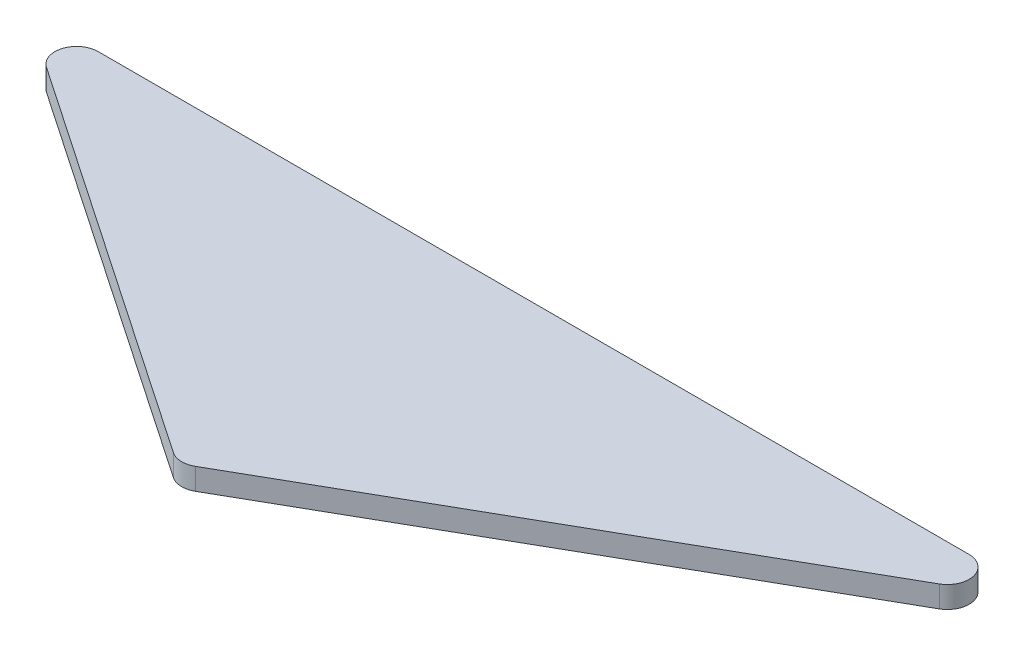
ISO-10303-21;
HEADER;
FILE_DESCRIPTION(('STEP AP214'),'2;1');
FILE_NAME('part.step','',(''),(''),'','','');
FILE_SCHEMA(('AUTOMOTIVE_DESIGN { 1 0 10303 214 1 1 1 1 }'));
ENDSEC;
DATA;
#1=APPLICATION_CONTEXT('core data for automotive mechanical design processes');
#2=APPLICATION_PROTOCOL_DEFINITION('international standard','automotive_design',2000,#1);
#3=PRODUCT_CONTEXT('',#1,'mechanical');
#4=PRODUCT('Part','Part','',(#3));
#5=PRODUCT_RELATED_PRODUCT_CATEGORY('part','',(#4));
#6=PRODUCT_DEFINITION_FORMATION('','',#4);
#7=PRODUCT_DEFINITION_CONTEXT('part definition',#1,'design');
#8=PRODUCT_DEFINITION('design','',#6,#7);
#9=PRODUCT_DEFINITION_SHAPE('','',#8);
#10=(LENGTH_UNIT() NAMED_UNIT(*) SI_UNIT(.MILLI.,.METRE.));
#11=(NAMED_UNIT(*) PLANE_ANGLE_UNIT() SI_UNIT($,.RADIAN.));
#12=(NAMED_UNIT(*) SI_UNIT($,.STERADIAN.) SOLID_ANGLE_UNIT());
#13=UNCERTAINTY_MEASURE_WITH_UNIT(LENGTH_MEASURE(1.E-05),#10,'distance_accuracy_value','');
#14=(GEOMETRIC_REPRESENTATION_CONTEXT(3) GLOBAL_UNCERTAINTY_ASSIGNED_CONTEXT((#13)) GLOBAL_UNIT_ASSIGNED_CONTEXT((#10,
#11,#12)) REPRESENTATION_CONTEXT('',''));
#15=CARTESIAN_POINT('',(0.,0.,0.));
#16=DIRECTION('',(0.,0.,1.));
#17=DIRECTION('',(1.,0.,0.));
#18=AXIS2_PLACEMENT_3D('',#15,#16,#17);
#19=CARTESIAN_POINT('',(0.,3.175,0.));
#20=DIRECTION('',(-0.495285329308495,0.,-0.86873036240929));
#21=DIRECTION('',(-0.86873036240929,0.,0.495285329308495));
#22=AXIS2_PLACEMENT_3D('',#19,#20,#21);
#23=PLANE('',#22);
#24=DIRECTION('',(0.86873036240929,0.,-0.495285329308495));
#25=VECTOR('',#24,1.);
#26=CARTESIAN_POINT('',(0.,0.,0.));
#27=LINE('',#26,#25);
#28=CARTESIAN_POINT('',(1.7208405564904,0.,-0.981095076894767));
#29=VERTEX_POINT('',#28);
#30=CARTESIAN_POINT('',(71.2065111279232,0.,-40.5966475202886));
#31=VERTEX_POINT('',#30);
#32=EDGE_CURVE('E125',#29,#31,#27,.T.);
#33=ORIENTED_EDGE('',*,*,#32,.T.);
#34=DIRECTION('',(0.,-1.,0.));
#35=VECTOR('',#34,1.);
#36=CARTESIAN_POINT('',(71.2065111279232,3.175,-40.5966475202886));
#37=LINE('',#36,#35);
#38=CARTESIAN_POINT('',(71.2065111279232,3.175,-40.5966475202886));
#39=VERTEX_POINT('',#38);
#40=EDGE_CURVE('E11',#31,#39,#37,.F.);
#41=ORIENTED_EDGE('',*,*,#40,.T.);
#42=DIRECTION('',(0.86873036240929,0.,-0.495285329308495));
#43=VECTOR('',#42,1.);
#44=CARTESIAN_POINT('',(0.,3.175,0.));
#45=LINE('',#44,#43);
#46=CARTESIAN_POINT('',(1.7208405564904,3.175,-0.981095076894767));
#47=VERTEX_POINT('',#46);
#48=EDGE_CURVE('E116',#47,#39,#45,.T.);
#49=ORIENTED_EDGE('',*,*,#48,.F.);
#50=DIRECTION('',(0.,-1.,0.));
#51=VECTOR('',#50,1.);
#52=CARTESIAN_POINT('',(1.7208405564904,3.175,-0.981095076894767));
#53=LINE('',#52,#51);
#54=EDGE_CURVE('E50',#47,#29,#53,.T.);
#55=ORIENTED_EDGE('',*,*,#54,.T.);
#56=EDGE_LOOP('',(#33,#41,#49,#55));
#57=FACE_BOUND('',#56,.T.);
#58=ADVANCED_FACE('F39',(#57),#23,.F.);
#59=CARTESIAN_POINT('',(81.6133758194562,3.175,-46.529866420938));
#60=DIRECTION('',(0.,0.,1.));
#61=DIRECTION('',(1.,0.,0.));
#62=AXIS2_PLACEMENT_3D('',#59,#60,#61);
#63=PLANE('',#62);
#64=DIRECTION('',(-1.,0.,0.));
#65=VECTOR('',#64,1.);
#66=CARTESIAN_POINT('',(81.6133758194562,0.,-46.529866420938));
#67=LINE('',#66,#65);
#68=CARTESIAN_POINT('',(69.6339802073688,0.,-46.529866420938));
#69=VERTEX_POINT('',#68);
#70=CARTESIAN_POINT('',(-58.0760977187323,0.,-46.529866420938));
#71=VERTEX_POINT('',#70);
#72=EDGE_CURVE('E120',#69,#71,#67,.T.);
#73=ORIENTED_EDGE('',*,*,#72,.T.);
#74=DIRECTION('',(0.,-1.,0.));
#75=VECTOR('',#74,1.);
#76=CARTESIAN_POINT('',(-58.0760977187323,3.175,-46.529866420938));
#77=LINE('',#76,#75);
#78=CARTESIAN_POINT('',(-58.0760977187323,3.175,-46.529866420938));
#79=VERTEX_POINT('',#78);
#80=EDGE_CURVE('E100',#71,#79,#77,.F.);
#81=ORIENTED_EDGE('',*,*,#80,.T.);
#82=DIRECTION('',(-1.,0.,0.));
#83=VECTOR('',#82,1.);
#84=CARTESIAN_POINT('',(81.6133758194562,3.175,-46.529866420938));
#85=LINE('',#84,#83);
#86=CARTESIAN_POINT('',(69.6339802073688,3.175,-46.529866420938));
#87=VERTEX_POINT('',#86);
#88=EDGE_CURVE('E117',#87,#79,#85,.T.);
#89=ORIENTED_EDGE('',*,*,#88,.F.);
#90=DIRECTION('',(0.,-1.,0.));
#91=VECTOR('',#90,1.);
#92=CARTESIAN_POINT('',(69.6339802073688,3.175,-46.529866420938));
#93=LINE('',#92,#91);
#94=EDGE_CURVE('E105',#87,#69,#93,.T.);
#95=ORIENTED_EDGE('',*,*,#94,.T.);
#96=EDGE_LOOP('',(#73,#81,#89,#95));
#97=FACE_BOUND('',#96,.T.);
#98=ADVANCED_FACE('F150',(#97),#63,.F.);
#99=CARTESIAN_POINT('',(0.,3.175,0.));
#100=DIRECTION('',(0.562532896681354,0.,-0.826774902951997));
#101=DIRECTION('',(-0.826774902951998,0.,-0.562532896681354));
#102=AXIS2_PLACEMENT_3D('',#99,#100,#101);
#103=PLANE('',#102);
#104=DIRECTION('',(0.826774902951998,0.,0.562532896681354));
#105=VECTOR('',#104,1.);
#106=CARTESIAN_POINT('',(0.,3.175,0.));
#107=LINE('',#106,#105);
#108=CARTESIAN_POINT('',(-59.8621396656956,3.175,-40.7298561040654));
#109=VERTEX_POINT('',#108);
#110=CARTESIAN_POINT('',(-1.63773231102737,3.175,-1.11430366067167));
#111=VERTEX_POINT('',#110);
#112=EDGE_CURVE('E112',#109,#111,#107,.T.);
#113=ORIENTED_EDGE('',*,*,#112,.F.);
#114=DIRECTION('',(0.,-1.,0.));
#115=VECTOR('',#114,1.);
#116=CARTESIAN_POINT('',(-59.8621396656956,3.175,-40.7298561040654));
#117=LINE('',#116,#115);
#118=CARTESIAN_POINT('',(-59.8621396656956,0.,-40.7298561040654));
#119=VERTEX_POINT('',#118);
#120=EDGE_CURVE('E96',#109,#119,#117,.T.);
#121=ORIENTED_EDGE('',*,*,#120,.T.);
#122=DIRECTION('',(0.826774902951998,0.,0.562532896681354));
#123=VECTOR('',#122,1.);
#124=CARTESIAN_POINT('',(0.,0.,0.));
#125=LINE('',#124,#123);
#126=CARTESIAN_POINT('',(-1.63773231102737,0.,-1.11430366067167));
#127=VERTEX_POINT('',#126);
#128=EDGE_CURVE('E108',#119,#127,#125,.T.);
#129=ORIENTED_EDGE('',*,*,#128,.T.);
#130=DIRECTION('',(0.,-1.,0.));
#131=VECTOR('',#130,1.);
#132=CARTESIAN_POINT('',(-1.63773231102737,3.175,-1.11430366067167));
#133=LINE('',#132,#131);
#134=EDGE_CURVE('E114',#127,#111,#133,.F.);
#135=ORIENTED_EDGE('',*,*,#134,.T.);
#136=EDGE_LOOP('',(#113,#121,#129,#135));
#137=FACE_BOUND('',#136,.T.);
#138=ADVANCED_FACE('F107',(#137),#103,.F.);
#139=CARTESIAN_POINT('',(0.,3.175,0.));
#140=DIRECTION('',(0.,1.,0.));
#141=DIRECTION('',(0.,0.,1.));
#142=AXIS2_PLACEMENT_3D('',#139,#140,#141);
#143=PLANE('',#142);
#144=ORIENTED_EDGE('',*,*,#88,.T.);
#145=CARTESIAN_POINT('',(-58.0760977187323,3.175,-43.354866420938));
#146=DIRECTION('',(0.,1.,0.));
#147=DIRECTION('',(0.,0.,1.));
#148=AXIS2_PLACEMENT_3D('',#145,#146,#147);
#149=CIRCLE('',#148,3.175);
#150=EDGE_CURVE('E132',#79,#109,#149,.T.);
#151=ORIENTED_EDGE('',*,*,#150,.T.);
#152=ORIENTED_EDGE('',*,*,#112,.T.);
#153=CARTESIAN_POINT('',(0.148309635935928,3.175,-3.73931397754426));
#154=DIRECTION('',(0.,1.,0.));
#155=DIRECTION('',(0.,0.,1.));
#156=AXIS2_PLACEMENT_3D('',#153,#154,#155);
#157=CIRCLE('',#156,3.175);
#158=EDGE_CURVE('E56',#111,#47,#157,.T.);
#159=ORIENTED_EDGE('',*,*,#158,.T.);
#160=ORIENTED_EDGE('',*,*,#48,.T.);
#161=CARTESIAN_POINT('',(69.6339802073688,3.175,-43.354866420938));
#162=DIRECTION('',(0.,1.,0.));
#163=DIRECTION('',(0.,0.,1.));
#164=AXIS2_PLACEMENT_3D('',#161,#162,#163);
#165=CIRCLE('',#164,3.175);
#166=EDGE_CURVE('E135',#39,#87,#165,.T.);
#167=ORIENTED_EDGE('',*,*,#166,.T.);
#168=EDGE_LOOP('',(#144,#151,#152,#159,#160,#167));
#169=FACE_BOUND('',#168,.T.);
#170=ADVANCED_FACE('F141',(#169),#143,.T.);
#171=CARTESIAN_POINT('',(0.,0.,0.));
#172=DIRECTION('',(0.,1.,0.));
#173=DIRECTION('',(0.,0.,1.));
#174=AXIS2_PLACEMENT_3D('',#171,#172,#173);
#175=PLANE('',#174);
#176=ORIENTED_EDGE('',*,*,#128,.F.);
#177=CARTESIAN_POINT('',(-58.0760977187323,0.,-43.354866420938));
#178=DIRECTION('',(0.,1.,0.));
#179=DIRECTION('',(0.,0.,1.));
#180=AXIS2_PLACEMENT_3D('',#177,#178,#179);
#181=CIRCLE('',#180,3.175);
#182=EDGE_CURVE('E95',#119,#71,#181,.F.);
#183=ORIENTED_EDGE('',*,*,#182,.T.);
#184=ORIENTED_EDGE('',*,*,#72,.F.);
#185=CARTESIAN_POINT('',(69.6339802073688,0.,-43.354866420938));
#186=DIRECTION('',(0.,1.,0.));
#187=DIRECTION('',(0.,0.,1.));
#188=AXIS2_PLACEMENT_3D('',#185,#186,#187);
#189=CIRCLE('',#188,3.175);
#190=EDGE_CURVE('E103',#69,#31,#189,.F.);
#191=ORIENTED_EDGE('',*,*,#190,.T.);
#192=ORIENTED_EDGE('',*,*,#32,.F.);
#193=CARTESIAN_POINT('',(0.148309635935928,0.,-3.73931397754426));
#194=DIRECTION('',(0.,1.,0.));
#195=DIRECTION('',(0.,0.,1.));
#196=AXIS2_PLACEMENT_3D('',#193,#194,#195);
#197=CIRCLE('',#196,3.175);
#198=EDGE_CURVE('E115',#29,#127,#197,.F.);
#199=ORIENTED_EDGE('',*,*,#198,.T.);
#200=EDGE_LOOP('',(#176,#183,#184,#191,#192,#199));
#201=FACE_BOUND('',#200,.T.);
#202=ADVANCED_FACE('F113',(#201),#175,.F.);
#203=CARTESIAN_POINT('',(-58.0760977187323,3.175,-43.354866420938));
#204=DIRECTION('',(0.,-1.,0.));
#205=DIRECTION('',(0.,0.,-1.));
#206=AXIS2_PLACEMENT_3D('',#203,#204,#205);
#207=CYLINDRICAL_SURFACE('',#206,3.175);
#208=ORIENTED_EDGE('',*,*,#150,.F.);
#209=ORIENTED_EDGE('',*,*,#80,.F.);
#210=ORIENTED_EDGE('',*,*,#182,.F.);
#211=ORIENTED_EDGE('',*,*,#120,.F.);
#212=EDGE_LOOP('',(#208,#209,#210,#211));
#213=FACE_BOUND('',#212,.T.);
#214=ADVANCED_FACE('F92',(#213),#207,.T.);
#215=CARTESIAN_POINT('',(69.6339802073688,3.175,-43.354866420938));
#216=DIRECTION('',(0.,-1.,0.));
#217=DIRECTION('',(0.,0.,-1.));
#218=AXIS2_PLACEMENT_3D('',#215,#216,#217);
#219=CYLINDRICAL_SURFACE('',#218,3.175);
#220=ORIENTED_EDGE('',*,*,#166,.F.);
#221=ORIENTED_EDGE('',*,*,#40,.F.);
#222=ORIENTED_EDGE('',*,*,#190,.F.);
#223=ORIENTED_EDGE('',*,*,#94,.F.);
#224=EDGE_LOOP('',(#220,#221,#222,#223));
#225=FACE_BOUND('',#224,.T.);
#226=ADVANCED_FACE('F149',(#225),#219,.T.);
#227=CARTESIAN_POINT('',(0.148309635935928,3.175,-3.73931397754426));
#228=DIRECTION('',(0.,-1.,0.));
#229=DIRECTION('',(0.,0.,-1.));
#230=AXIS2_PLACEMENT_3D('',#227,#228,#229);
#231=CYLINDRICAL_SURFACE('',#230,3.175);
#232=ORIENTED_EDGE('',*,*,#158,.F.);
#233=ORIENTED_EDGE('',*,*,#134,.F.);
#234=ORIENTED_EDGE('',*,*,#198,.F.);
#235=ORIENTED_EDGE('',*,*,#54,.F.);
#236=EDGE_LOOP('',(#232,#233,#234,#235));
#237=FACE_BOUND('',#236,.T.);
#238=ADVANCED_FACE('F41',(#237),#231,.T.);
#239=CLOSED_SHELL('',(#58,#98,#138,#170,#202,#214,#226,#238));
#240=MANIFOLD_SOLID_BREP('B2',#239);
#241=ADVANCED_BREP_SHAPE_REPRESENTATION('',(#18,#240),#14);
#242=SHAPE_DEFINITION_REPRESENTATION(#9,#241);
ENDSEC;
END-ISO-10303-21;
